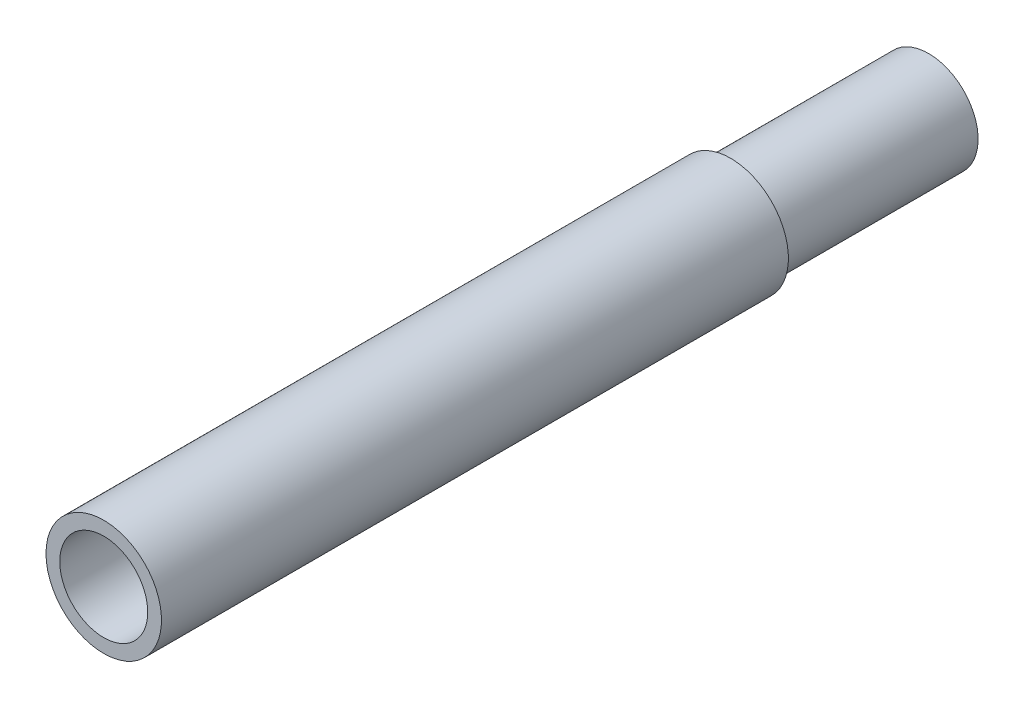
ISO-10303-21;
HEADER;
FILE_DESCRIPTION(('STEP AP214'),'2;1');
FILE_NAME('part.step','',(''),(''),'','','');
FILE_SCHEMA(('AUTOMOTIVE_DESIGN { 1 0 10303 214 1 1 1 1 }'));
ENDSEC;
DATA;
#1=APPLICATION_CONTEXT('core data for automotive mechanical design processes');
#2=APPLICATION_PROTOCOL_DEFINITION('international standard','automotive_design',2000,#1);
#3=PRODUCT_CONTEXT('',#1,'mechanical');
#4=PRODUCT('Part','Part','',(#3));
#5=PRODUCT_RELATED_PRODUCT_CATEGORY('part','',(#4));
#6=PRODUCT_DEFINITION_FORMATION('','',#4);
#7=PRODUCT_DEFINITION_CONTEXT('part definition',#1,'design');
#8=PRODUCT_DEFINITION('design','',#6,#7);
#9=PRODUCT_DEFINITION_SHAPE('','',#8);
#10=(LENGTH_UNIT() NAMED_UNIT(*) SI_UNIT(.MILLI.,.METRE.));
#11=(NAMED_UNIT(*) PLANE_ANGLE_UNIT() SI_UNIT($,.RADIAN.));
#12=(NAMED_UNIT(*) SI_UNIT($,.STERADIAN.) SOLID_ANGLE_UNIT());
#13=UNCERTAINTY_MEASURE_WITH_UNIT(LENGTH_MEASURE(1.E-05),#10,'distance_accuracy_value','');
#14=(GEOMETRIC_REPRESENTATION_CONTEXT(3) GLOBAL_UNCERTAINTY_ASSIGNED_CONTEXT((#13)) GLOBAL_UNIT_ASSIGNED_CONTEXT((#10,
#11,#12)) REPRESENTATION_CONTEXT('',''));
#15=CARTESIAN_POINT('',(0.,0.,0.));
#16=DIRECTION('',(0.,0.,1.));
#17=DIRECTION('',(1.,0.,0.));
#18=AXIS2_PLACEMENT_3D('',#15,#16,#17);
#19=CARTESIAN_POINT('',(0.,0.,114.));
#20=DIRECTION('',(0.,0.,1.));
#21=DIRECTION('',(1.,0.,0.));
#22=AXIS2_PLACEMENT_3D('',#19,#20,#21);
#23=PLANE('',#22);
#24=CARTESIAN_POINT('',(0.,0.,114.));
#25=DIRECTION('',(0.,0.,1.));
#26=DIRECTION('',(1.,0.,0.));
#27=AXIS2_PLACEMENT_3D('',#24,#25,#26);
#28=CIRCLE('',#27,10.5);
#29=CARTESIAN_POINT('',(-10.5,0.,114.));
#30=VERTEX_POINT('',#29);
#31=EDGE_CURVE('E44',#30,#30,#28,.T.);
#32=ORIENTED_EDGE('',*,*,#31,.T.);
#33=EDGE_LOOP('',(#32));
#34=FACE_BOUND('',#33,.T.);
#35=CARTESIAN_POINT('',(0.,0.,114.));
#36=DIRECTION('',(0.,0.,1.));
#37=DIRECTION('',(1.,0.,0.));
#38=AXIS2_PLACEMENT_3D('',#35,#36,#37);
#39=CIRCLE('',#38,8.);
#40=CARTESIAN_POINT('',(-8.,0.,114.));
#41=VERTEX_POINT('',#40);
#42=EDGE_CURVE('E53',#41,#41,#39,.T.);
#43=ORIENTED_EDGE('',*,*,#42,.F.);
#44=EDGE_LOOP('',(#43));
#45=FACE_BOUND('',#44,.T.);
#46=ADVANCED_FACE('F40',(#34,#45),#23,.T.);
#47=CARTESIAN_POINT('',(0.,0.,0.));
#48=DIRECTION('',(0.,0.,1.));
#49=DIRECTION('',(1.,0.,0.));
#50=AXIS2_PLACEMENT_3D('',#47,#48,#49);
#51=PLANE('',#50);
#52=CARTESIAN_POINT('',(0.,0.,0.));
#53=DIRECTION('',(0.,0.,-1.));
#54=DIRECTION('',(-1.,0.,0.));
#55=AXIS2_PLACEMENT_3D('',#52,#53,#54);
#56=CIRCLE('',#55,9.);
#57=CARTESIAN_POINT('',(-9.,0.,0.));
#58=VERTEX_POINT('',#57);
#59=EDGE_CURVE('E10',#58,#58,#56,.T.);
#60=ORIENTED_EDGE('',*,*,#59,.F.);
#61=EDGE_LOOP('',(#60));
#62=FACE_BOUND('',#61,.T.);
#63=CARTESIAN_POINT('',(0.,0.,0.));
#64=DIRECTION('',(0.,0.,1.));
#65=DIRECTION('',(1.,0.,0.));
#66=AXIS2_PLACEMENT_3D('',#63,#64,#65);
#67=CIRCLE('',#66,10.5);
#68=CARTESIAN_POINT('',(-10.5,0.,0.));
#69=VERTEX_POINT('',#68);
#70=EDGE_CURVE('E41',#69,#69,#67,.T.);
#71=ORIENTED_EDGE('',*,*,#70,.F.);
#72=EDGE_LOOP('',(#71));
#73=FACE_BOUND('',#72,.T.);
#74=ADVANCED_FACE('F76',(#62,#73),#51,.F.);
#75=CARTESIAN_POINT('',(0.,0.,114.));
#76=DIRECTION('',(0.,0.,-1.));
#77=DIRECTION('',(-1.,0.,0.));
#78=AXIS2_PLACEMENT_3D('',#75,#76,#77);
#79=CYLINDRICAL_SURFACE('',#78,10.5);
#80=CARTESIAN_POINT('',(-10.5,0.,114.));
#81=CARTESIAN_POINT('',(-10.5,0.,112.8125));
#82=CARTESIAN_POINT('',(-10.5,0.,111.625));
#83=CARTESIAN_POINT('',(-10.5,0.,109.25));
#84=CARTESIAN_POINT('',(-10.5,0.,108.0625));
#85=CARTESIAN_POINT('',(-10.5,0.,105.6875));
#86=CARTESIAN_POINT('',(-10.5,0.,104.5));
#87=CARTESIAN_POINT('',(-10.5,0.,102.125));
#88=CARTESIAN_POINT('',(-10.5,0.,100.9375));
#89=CARTESIAN_POINT('',(-10.5,0.,98.5625));
#90=CARTESIAN_POINT('',(-10.5,0.,97.375));
#91=CARTESIAN_POINT('',(-10.5,0.,95.));
#92=CARTESIAN_POINT('',(-10.5,0.,93.8125));
#93=CARTESIAN_POINT('',(-10.5,0.,91.4375));
#94=CARTESIAN_POINT('',(-10.5,0.,90.25));
#95=CARTESIAN_POINT('',(-10.5,0.,87.875));
#96=CARTESIAN_POINT('',(-10.5,0.,86.6875));
#97=CARTESIAN_POINT('',(-10.5,0.,84.3125));
#98=CARTESIAN_POINT('',(-10.5,0.,83.125));
#99=CARTESIAN_POINT('',(-10.5,0.,80.75));
#100=CARTESIAN_POINT('',(-10.5,0.,79.5625));
#101=CARTESIAN_POINT('',(-10.5,0.,77.1875));
#102=CARTESIAN_POINT('',(-10.5,0.,76.));
#103=CARTESIAN_POINT('',(-10.5,0.,73.625));
#104=CARTESIAN_POINT('',(-10.5,0.,72.4375));
#105=CARTESIAN_POINT('',(-10.5,0.,70.0625));
#106=CARTESIAN_POINT('',(-10.5,0.,68.875));
#107=CARTESIAN_POINT('',(-10.5,0.,66.5));
#108=CARTESIAN_POINT('',(-10.5,0.,65.3125));
#109=CARTESIAN_POINT('',(-10.5,0.,62.9375));
#110=CARTESIAN_POINT('',(-10.5,0.,61.75));
#111=CARTESIAN_POINT('',(-10.5,0.,59.375));
#112=CARTESIAN_POINT('',(-10.5,0.,58.1875));
#113=CARTESIAN_POINT('',(-10.5,0.,55.8125));
#114=CARTESIAN_POINT('',(-10.5,0.,54.625));
#115=CARTESIAN_POINT('',(-10.5,0.,52.25));
#116=CARTESIAN_POINT('',(-10.5,0.,51.0625));
#117=CARTESIAN_POINT('',(-10.5,0.,48.6875));
#118=CARTESIAN_POINT('',(-10.5,0.,47.5));
#119=CARTESIAN_POINT('',(-10.5,0.,45.125));
#120=CARTESIAN_POINT('',(-10.5,0.,43.9375));
#121=CARTESIAN_POINT('',(-10.5,0.,41.5625));
#122=CARTESIAN_POINT('',(-10.5,0.,40.375));
#123=CARTESIAN_POINT('',(-10.5,0.,38.));
#124=CARTESIAN_POINT('',(-10.5,0.,36.8125));
#125=CARTESIAN_POINT('',(-10.5,0.,34.4375));
#126=CARTESIAN_POINT('',(-10.5,0.,33.25));
#127=CARTESIAN_POINT('',(-10.5,0.,30.875));
#128=CARTESIAN_POINT('',(-10.5,0.,29.6875));
#129=CARTESIAN_POINT('',(-10.5,0.,27.3125));
#130=CARTESIAN_POINT('',(-10.5,0.,26.125));
#131=CARTESIAN_POINT('',(-10.5,0.,23.75));
#132=CARTESIAN_POINT('',(-10.5,0.,22.5625));
#133=CARTESIAN_POINT('',(-10.5,0.,20.1875));
#134=CARTESIAN_POINT('',(-10.5,0.,19.));
#135=CARTESIAN_POINT('',(-10.5,0.,16.625));
#136=CARTESIAN_POINT('',(-10.5,0.,15.4375));
#137=CARTESIAN_POINT('',(-10.5,0.,13.0625));
#138=CARTESIAN_POINT('',(-10.5,0.,11.875));
#139=CARTESIAN_POINT('',(-10.5,0.,9.5));
#140=CARTESIAN_POINT('',(-10.5,0.,8.31250000000001));
#141=CARTESIAN_POINT('',(-10.5,0.,5.9375));
#142=CARTESIAN_POINT('',(-10.5,0.,4.75));
#143=CARTESIAN_POINT('',(-10.5,0.,2.375));
#144=CARTESIAN_POINT('',(-10.5,0.,1.1875));
#145=CARTESIAN_POINT('',(-10.5,0.,0.));
#146=B_SPLINE_CURVE_WITH_KNOTS('',3,(#80,#81,#82,#83,#84,#85,#86,#87,#88,#89,#90,#91,#92,#93,
#94,#95,#96,#97,#98,#99,#100,#101,#102,#103,#104,#105,#106,#107,#108,#109,#110,#111,#112,#113,
#114,#115,#116,#117,#118,#119,#120,#121,#122,#123,#124,#125,#126,#127,#128,#129,#130,#131,#132,
#133,#134,#135,#136,#137,#138,#139,#140,#141,#142,#143,#144,#145),.UNSPECIFIED.,.F.,.F.,(4,2,2,
2,2,2,2,2,2,2,2,2,2,2,2,2,2,2,2,2,2,2,2,2,2,2,2,2,2,2,2,2,4),(0.,3.5625,7.12499999999999,
10.6875,14.25,17.8125,21.375,24.9375,28.5,32.0625,35.625,39.1875,42.75,46.3125,49.875,53.4375,
57.,60.5625,64.125,67.6875,71.25,74.8125,78.375,81.9375,85.5,89.0625,92.625,96.1875,99.75,
103.3125,106.875,110.4375,114.),.UNSPECIFIED.);
#147=EDGE_CURVE('BSEAM39',#30,#69,#146,.T.);
#148=ORIENTED_EDGE('',*,*,#31,.F.);
#149=ORIENTED_EDGE('',*,*,#70,.T.);
#150=ORIENTED_EDGE('',*,*,#147,.T.);
#151=ORIENTED_EDGE('',*,*,#147,.F.);
#152=EDGE_LOOP('',(#148,#150,#149,#151));
#153=FACE_BOUND('',#152,.T.);
#154=ADVANCED_FACE('F39',(#153),#79,.T.);
#155=CARTESIAN_POINT('',(0.,0.,114.));
#156=DIRECTION('',(0.,0.,-1.));
#157=DIRECTION('',(-1.,0.,0.));
#158=AXIS2_PLACEMENT_3D('',#155,#156,#157);
#159=CYLINDRICAL_SURFACE('',#158,8.);
#160=CARTESIAN_POINT('',(0.,0.,-36.));
#161=DIRECTION('',(0.,0.,-1.));
#162=DIRECTION('',(-1.,0.,0.));
#163=AXIS2_PLACEMENT_3D('',#160,#161,#162);
#164=CIRCLE('',#163,8.);
#165=CARTESIAN_POINT('',(-8.,0.,-36.));
#166=VERTEX_POINT('',#165);
#167=EDGE_CURVE('E58',#166,#166,#164,.T.);
#168=CARTESIAN_POINT('',(-8.,0.,114.));
#169=CARTESIAN_POINT('',(-8.,0.,112.4375));
#170=CARTESIAN_POINT('',(-8.,0.,110.875));
#171=CARTESIAN_POINT('',(-8.,0.,107.75));
#172=CARTESIAN_POINT('',(-8.,0.,106.1875));
#173=CARTESIAN_POINT('',(-8.,0.,103.0625));
#174=CARTESIAN_POINT('',(-8.,0.,101.5));
#175=CARTESIAN_POINT('',(-8.,0.,98.375));
#176=CARTESIAN_POINT('',(-8.,0.,96.8125));
#177=CARTESIAN_POINT('',(-8.,0.,93.6875));
#178=CARTESIAN_POINT('',(-8.,0.,92.125));
#179=CARTESIAN_POINT('',(-8.,0.,89.));
#180=CARTESIAN_POINT('',(-8.,0.,87.4375));
#181=CARTESIAN_POINT('',(-8.,0.,84.3125));
#182=CARTESIAN_POINT('',(-8.,0.,82.75));
#183=CARTESIAN_POINT('',(-8.,0.,79.625));
#184=CARTESIAN_POINT('',(-8.,0.,78.0625));
#185=CARTESIAN_POINT('',(-8.,0.,74.9375));
#186=CARTESIAN_POINT('',(-8.,0.,73.375));
#187=CARTESIAN_POINT('',(-8.,0.,70.25));
#188=CARTESIAN_POINT('',(-8.,0.,68.6875));
#189=CARTESIAN_POINT('',(-8.,0.,65.5625));
#190=CARTESIAN_POINT('',(-8.,0.,64.));
#191=CARTESIAN_POINT('',(-8.,0.,60.875));
#192=CARTESIAN_POINT('',(-8.,0.,59.3125));
#193=CARTESIAN_POINT('',(-8.,0.,56.1875));
#194=CARTESIAN_POINT('',(-8.,0.,54.625));
#195=CARTESIAN_POINT('',(-8.,0.,51.5));
#196=CARTESIAN_POINT('',(-8.,0.,49.9375));
#197=CARTESIAN_POINT('',(-8.,0.,46.8125));
#198=CARTESIAN_POINT('',(-8.,0.,45.25));
#199=CARTESIAN_POINT('',(-8.,0.,42.125));
#200=CARTESIAN_POINT('',(-8.,0.,40.5625));
#201=CARTESIAN_POINT('',(-8.,0.,37.4375));
#202=CARTESIAN_POINT('',(-8.,0.,35.875));
#203=CARTESIAN_POINT('',(-8.,0.,32.75));
#204=CARTESIAN_POINT('',(-8.,0.,31.1875));
#205=CARTESIAN_POINT('',(-8.,0.,28.0625));
#206=CARTESIAN_POINT('',(-8.,0.,26.5));
#207=CARTESIAN_POINT('',(-8.,0.,23.375));
#208=CARTESIAN_POINT('',(-8.,0.,21.8125));
#209=CARTESIAN_POINT('',(-8.,0.,18.6875));
#210=CARTESIAN_POINT('',(-8.,0.,17.125));
#211=CARTESIAN_POINT('',(-8.,0.,14.));
#212=CARTESIAN_POINT('',(-8.,0.,12.4375));
#213=CARTESIAN_POINT('',(-8.,0.,9.3125));
#214=CARTESIAN_POINT('',(-8.,0.,7.75));
#215=CARTESIAN_POINT('',(-8.,0.,4.625));
#216=CARTESIAN_POINT('',(-8.,0.,3.0625));
#217=CARTESIAN_POINT('',(-8.,0.,-0.0624999999999977));
#218=CARTESIAN_POINT('',(-8.,0.,-1.625));
#219=CARTESIAN_POINT('',(-8.,0.,-4.74999999999999));
#220=CARTESIAN_POINT('',(-8.,0.,-6.31249999999999));
#221=CARTESIAN_POINT('',(-8.,0.,-9.43749999999999));
#222=CARTESIAN_POINT('',(-8.,0.,-11.));
#223=CARTESIAN_POINT('',(-8.,0.,-14.125));
#224=CARTESIAN_POINT('',(-8.,0.,-15.6875));
#225=CARTESIAN_POINT('',(-8.,0.,-18.8125));
#226=CARTESIAN_POINT('',(-8.,0.,-20.375));
#227=CARTESIAN_POINT('',(-8.,0.,-23.5));
#228=CARTESIAN_POINT('',(-8.,0.,-25.0625));
#229=CARTESIAN_POINT('',(-8.,0.,-28.1875));
#230=CARTESIAN_POINT('',(-8.,0.,-29.75));
#231=CARTESIAN_POINT('',(-8.,0.,-32.875));
#232=CARTESIAN_POINT('',(-8.,0.,-34.4375));
#233=CARTESIAN_POINT('',(-8.,0.,-36.));
#234=B_SPLINE_CURVE_WITH_KNOTS('',3,(#168,#169,#170,#171,#172,#173,#174,#175,#176,#177,#178,
#179,#180,#181,#182,#183,#184,#185,#186,#187,#188,#189,#190,#191,#192,#193,#194,#195,#196,#197,
#198,#199,#200,#201,#202,#203,#204,#205,#206,#207,#208,#209,#210,#211,#212,#213,#214,#215,#216,
#217,#218,#219,#220,#221,#222,#223,#224,#225,#226,#227,#228,#229,#230,#231,#232,#233),
.UNSPECIFIED.,.F.,.F.,(4,2,2,2,2,2,2,2,2,2,2,2,2,2,2,2,2,2,2,2,2,2,2,2,2,2,2,2,2,2,2,2,4),(0.,
4.68750000000001,9.37500000000001,14.0625,18.75,23.4375,28.125,32.8125,37.5,42.1875,46.875,
51.5625,56.25,60.9375,65.625,70.3125,75.,79.6875,84.375,89.0625,93.75,98.4375,103.125,107.8125,
112.5,117.1875,121.875,126.5625,131.25,135.9375,140.625,145.3125,150.),.UNSPECIFIED.);
#235=EDGE_CURVE('BSEAM67',#41,#166,#234,.T.);
#236=ORIENTED_EDGE('',*,*,#42,.T.);
#237=ORIENTED_EDGE('',*,*,#167,.T.);
#238=ORIENTED_EDGE('',*,*,#235,.T.);
#239=ORIENTED_EDGE('',*,*,#235,.F.);
#240=EDGE_LOOP('',(#236,#238,#237,#239));
#241=FACE_BOUND('',#240,.T.);
#242=ADVANCED_FACE('F67',(#241),#159,.F.);
#243=CARTESIAN_POINT('',(0.,0.,-36.));
#244=DIRECTION('',(0.,0.,-1.));
#245=DIRECTION('',(-1.,0.,0.));
#246=AXIS2_PLACEMENT_3D('',#243,#244,#245);
#247=PLANE('',#246);
#248=CARTESIAN_POINT('',(0.,0.,-36.));
#249=DIRECTION('',(0.,0.,-1.));
#250=DIRECTION('',(-1.,0.,0.));
#251=AXIS2_PLACEMENT_3D('',#248,#249,#250);
#252=CIRCLE('',#251,9.);
#253=CARTESIAN_POINT('',(-9.,0.,-36.));
#254=VERTEX_POINT('',#253);
#255=EDGE_CURVE('E55',#254,#254,#252,.T.);
#256=ORIENTED_EDGE('',*,*,#255,.T.);
#257=EDGE_LOOP('',(#256));
#258=FACE_BOUND('',#257,.T.);
#259=ORIENTED_EDGE('',*,*,#167,.F.);
#260=EDGE_LOOP('',(#259));
#261=FACE_BOUND('',#260,.T.);
#262=ADVANCED_FACE('F68',(#258,#261),#247,.T.);
#263=CARTESIAN_POINT('',(0.,0.,-36.));
#264=DIRECTION('',(0.,0.,1.));
#265=DIRECTION('',(1.,0.,0.));
#266=AXIS2_PLACEMENT_3D('',#263,#264,#265);
#267=CYLINDRICAL_SURFACE('',#266,9.);
#268=ORIENTED_EDGE('',*,*,#255,.F.);
#269=EDGE_LOOP('',(#268));
#270=FACE_BOUND('',#269,.T.);
#271=ORIENTED_EDGE('',*,*,#59,.T.);
#272=EDGE_LOOP('',(#271));
#273=FACE_BOUND('',#272,.T.);
#274=ADVANCED_FACE('F66',(#270,#273),#267,.T.);
#275=CLOSED_SHELL('',(#46,#74,#154,#242,#262,#274));
#276=MANIFOLD_SOLID_BREP('B2',#275);
#277=ADVANCED_BREP_SHAPE_REPRESENTATION('',(#18,#276),#14);
#278=SHAPE_DEFINITION_REPRESENTATION(#9,#277);
ENDSEC;
END-ISO-10303-21;
